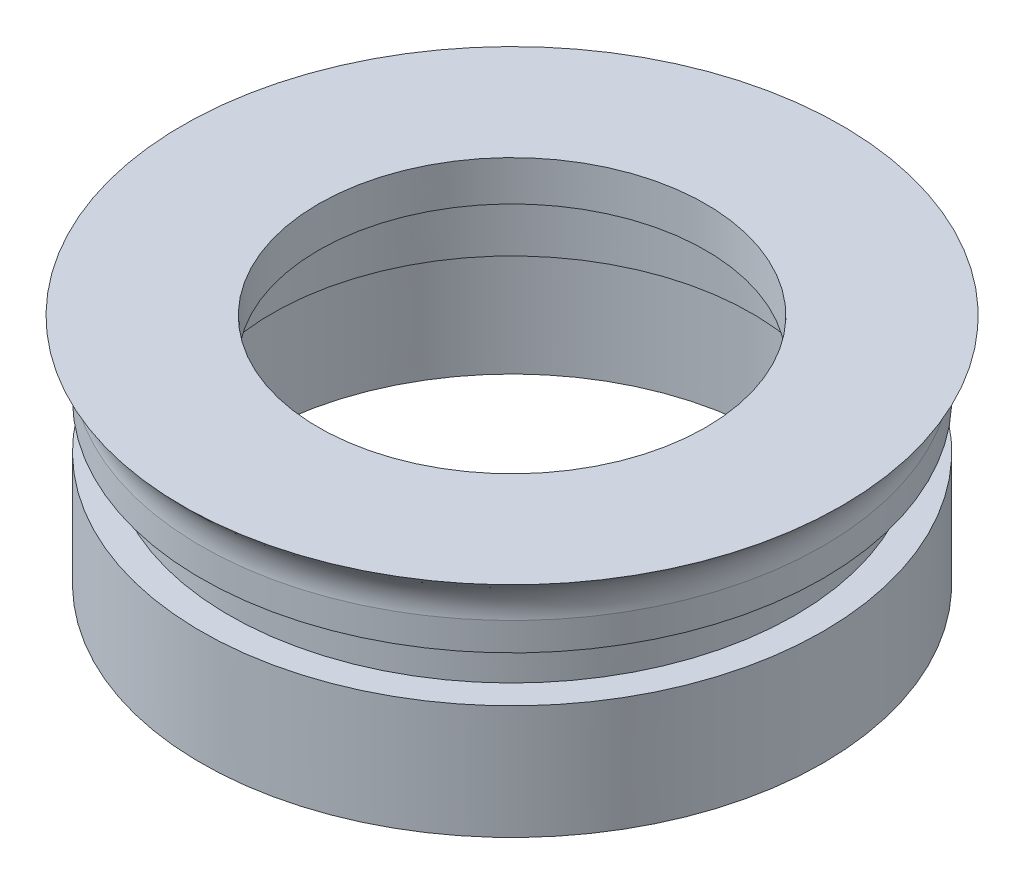
ISO-10303-21;
HEADER;
FILE_DESCRIPTION(('STEP AP214'),'2;1');
FILE_NAME('part.step','',(''),(''),'','','');
FILE_SCHEMA(('AUTOMOTIVE_DESIGN { 1 0 10303 214 1 1 1 1 }'));
ENDSEC;
DATA;
#1=APPLICATION_CONTEXT('core data for automotive mechanical design processes');
#2=APPLICATION_PROTOCOL_DEFINITION('international standard','automotive_design',2000,#1);
#3=PRODUCT_CONTEXT('',#1,'mechanical');
#4=PRODUCT('Part','Part','',(#3));
#5=PRODUCT_RELATED_PRODUCT_CATEGORY('part','',(#4));
#6=PRODUCT_DEFINITION_FORMATION('','',#4);
#7=PRODUCT_DEFINITION_CONTEXT('part definition',#1,'design');
#8=PRODUCT_DEFINITION('design','',#6,#7);
#9=PRODUCT_DEFINITION_SHAPE('','',#8);
#10=(LENGTH_UNIT() NAMED_UNIT(*) SI_UNIT(.MILLI.,.METRE.));
#11=(NAMED_UNIT(*) PLANE_ANGLE_UNIT() SI_UNIT($,.RADIAN.));
#12=(NAMED_UNIT(*) SI_UNIT($,.STERADIAN.) SOLID_ANGLE_UNIT());
#13=UNCERTAINTY_MEASURE_WITH_UNIT(LENGTH_MEASURE(1.E-05),#10,'distance_accuracy_value','');
#14=(GEOMETRIC_REPRESENTATION_CONTEXT(3) GLOBAL_UNCERTAINTY_ASSIGNED_CONTEXT((#13)) GLOBAL_UNIT_ASSIGNED_CONTEXT((#10,
#11,#12)) REPRESENTATION_CONTEXT('',''));
#15=CARTESIAN_POINT('',(0.,0.,0.));
#16=DIRECTION('',(0.,0.,1.));
#17=DIRECTION('',(1.,0.,0.));
#18=AXIS2_PLACEMENT_3D('',#15,#16,#17);
#19=CARTESIAN_POINT('',(0.000572404513093927,11.7084095589581,0.));
#20=DIRECTION('',(-4.88883233480967E-05,-0.999999998804966,0.));
#21=DIRECTION('',(0.999999998804966,-4.88883233480967E-05,0.));
#22=AXIS2_PLACEMENT_3D('',#19,#20,#21);
#23=TOROIDAL_SURFACE('',#22,21.8890333037088,3.03530258227153);
#24=CARTESIAN_POINT('',(0.000688708905054544,14.0873905477948,0.));
#25=DIRECTION('',(-4.88883233480967E-05,-0.999999998804966,0.));
#26=DIRECTION('',(0.999999998804966,-4.88883233480967E-05,0.));
#27=AXIS2_PLACEMENT_3D('',#24,#25,#26);
#28=CIRCLE('',#27,20.0039573882161);
#29=CARTESIAN_POINT('',(20.0046460732157,14.0864125878578,0.));
#30=VERTEX_POINT('',#29);
#31=EDGE_CURVE('E10',#30,#30,#28,.T.);
#32=ORIENTED_EDGE('',*,*,#31,.T.);
#33=EDGE_LOOP('',(#32));
#34=FACE_BOUND('',#33,.T.);
#35=CARTESIAN_POINT('',(0.000557715091473496,11.4079406412845,0.));
#36=DIRECTION('',(-4.88883233480967E-05,-0.999999998804966,0.));
#37=DIRECTION('',(0.999999998804966,-4.88883233480967E-05,0.));
#38=AXIS2_PLACEMENT_3D('',#35,#36,#37);
#39=CIRCLE('',#38,18.8686392573565);
#40=CARTESIAN_POINT('',(18.8691969498993,11.4070181851473,0.));
#41=VERTEX_POINT('',#40);
#42=EDGE_CURVE('E73',#41,#41,#39,.T.);
#43=ORIENTED_EDGE('',*,*,#42,.F.);
#44=EDGE_LOOP('',(#43));
#45=FACE_BOUND('',#44,.T.);
#46=ADVANCED_FACE('F30',(#34,#45),#23,.F.);
#47=CARTESIAN_POINT('',(0.000688708905054544,14.0873905477948,0.));
#48=DIRECTION('',(4.88883233480967E-05,0.999999998804966,0.));
#49=DIRECTION('',(-0.999999998804966,4.88883233480967E-05,0.));
#50=AXIS2_PLACEMENT_3D('',#47,#48,#49);
#51=CONICAL_SURFACE('',#50,20.0039573882161,1.57074743847153);
#52=CARTESIAN_POINT('',(0.000688689181484914,14.0869871064768,0.));
#53=DIRECTION('',(-4.88883233480967E-05,-0.999999998804966,0.));
#54=DIRECTION('',(0.999999998804966,-4.88883233480967E-05,0.));
#55=AXIS2_PLACEMENT_3D('',#52,#53,#54);
#56=CIRCLE('',#55,11.7516531493311);
#57=CARTESIAN_POINT('',(11.752341824469,14.0864125878578,0.));
#58=VERTEX_POINT('',#57);
#59=EDGE_CURVE('E36',#58,#58,#56,.T.);
#60=ORIENTED_EDGE('',*,*,#59,.T.);
#61=EDGE_LOOP('',(#60));
#62=FACE_BOUND('',#61,.T.);
#63=ORIENTED_EDGE('',*,*,#31,.F.);
#64=EDGE_LOOP('',(#63));
#65=FACE_BOUND('',#64,.T.);
#66=ADVANCED_FACE('F81',(#62,#65),#51,.F.);
#67=CARTESIAN_POINT('',(0.000688689181484914,14.0869871064768,0.));
#68=DIRECTION('',(-4.88883233480967E-05,-0.999999998804966,0.));
#69=DIRECTION('',(0.999999998804966,-4.88883233480967E-05,0.));
#70=AXIS2_PLACEMENT_3D('',#67,#68,#69);
#71=CONICAL_SURFACE('',#70,11.7516531493311,4.88883233672226E-05);
#72=CARTESIAN_POINT('',(0.000569602496550781,11.6510949212633,0.));
#73=DIRECTION('',(-4.88883233480967E-05,-0.999999998804966,0.));
#74=DIRECTION('',(0.999999998804966,-4.88883233480967E-05,0.));
#75=AXIS2_PLACEMENT_3D('',#72,#73,#74);
#76=CIRCLE('',#75,11.7517722360162);
#77=CARTESIAN_POINT('',(11.752341824469,11.6505203968223,0.));
#78=VERTEX_POINT('',#77);
#79=EDGE_CURVE('E40',#78,#78,#76,.T.);
#80=ORIENTED_EDGE('',*,*,#79,.T.);
#81=EDGE_LOOP('',(#80));
#82=FACE_BOUND('',#81,.T.);
#83=ORIENTED_EDGE('',*,*,#59,.F.);
#84=EDGE_LOOP('',(#83));
#85=FACE_BOUND('',#84,.T.);
#86=ADVANCED_FACE('F85',(#82,#85),#71,.F.);
#87=CARTESIAN_POINT('',(0.000569602496550781,11.6510949212633,0.));
#88=DIRECTION('',(4.88883233480967E-05,0.999999998804966,0.));
#89=DIRECTION('',(-0.999999998804966,4.88883233480967E-05,0.));
#90=AXIS2_PLACEMENT_3D('',#87,#88,#89);
#91=CONICAL_SURFACE('',#90,11.7517722360162,1.57074743847153);
#92=CARTESIAN_POINT('',(0.000569609199084234,11.6512320201242,0.));
#93=DIRECTION('',(-4.88883233480967E-05,-0.999999998804966,0.));
#94=DIRECTION('',(0.999999998804966,-4.88883233480967E-05,0.));
#95=AXIS2_PLACEMENT_3D('',#92,#93,#94);
#96=CIRCLE('',#95,14.5560995594777);
#97=CARTESIAN_POINT('',(14.5566691512817,11.6505203968223,0.));
#98=VERTEX_POINT('',#97);
#99=EDGE_CURVE('E44',#98,#98,#96,.T.);
#100=ORIENTED_EDGE('',*,*,#99,.T.);
#101=EDGE_LOOP('',(#100));
#102=FACE_BOUND('',#101,.T.);
#103=ORIENTED_EDGE('',*,*,#79,.F.);
#104=EDGE_LOOP('',(#103));
#105=FACE_BOUND('',#104,.T.);
#106=ADVANCED_FACE('F89',(#102,#105),#91,.T.);
#107=CARTESIAN_POINT('',(0.000569609199084234,11.6512320201242,0.));
#108=DIRECTION('',(-4.88883233480967E-05,-0.999999998804966,0.));
#109=DIRECTION('',(0.999999998804966,-4.88883233480967E-05,0.));
#110=AXIS2_PLACEMENT_3D('',#107,#108,#109);
#111=CONICAL_SURFACE('',#110,14.5560995594777,4.8888323367551E-05);
#112=CARTESIAN_POINT('',(0.000338980536321086,6.93377298915264,0.));
#113=DIRECTION('',(-4.88883233480967E-05,-0.999999998804966,0.));
#114=DIRECTION('',(0.999999998804966,-4.88883233480967E-05,0.));
#115=AXIS2_PLACEMENT_3D('',#112,#113,#114);
#116=CIRCLE('',#115,14.5563301881407);
#117=CARTESIAN_POINT('',(14.5566691512817,6.93306135457564,0.));
#118=VERTEX_POINT('',#117);
#119=EDGE_CURVE('E49',#118,#118,#116,.T.);
#120=ORIENTED_EDGE('',*,*,#119,.T.);
#121=EDGE_LOOP('',(#120));
#122=FACE_BOUND('',#121,.T.);
#123=ORIENTED_EDGE('',*,*,#99,.F.);
#124=EDGE_LOOP('',(#123));
#125=FACE_BOUND('',#124,.T.);
#126=ADVANCED_FACE('F96',(#122,#125),#111,.F.);
#127=CARTESIAN_POINT('',(0.000338980536321086,6.93377298915264,0.));
#128=DIRECTION('',(4.88883233480967E-05,0.999999998804966,0.));
#129=DIRECTION('',(-0.999999998804966,4.88883233480967E-05,0.));
#130=AXIS2_PLACEMENT_3D('',#127,#128,#129);
#131=CONICAL_SURFACE('',#130,14.5563301881407,1.57074743847153);
#132=CARTESIAN_POINT('',(0.000338982962872796,6.93382262373899,0.));
#133=DIRECTION('',(-4.88883233480967E-05,-0.999999998804966,0.));
#134=DIRECTION('',(0.999999998804966,-4.88883233480967E-05,0.));
#135=AXIS2_PLACEMENT_3D('',#132,#133,#134);
#136=CIRCLE('',#135,15.5715948353508);
#137=CARTESIAN_POINT('',(15.5719337997051,6.93306135457564,0.));
#138=VERTEX_POINT('',#137);
#139=EDGE_CURVE('E52',#138,#138,#136,.T.);
#140=ORIENTED_EDGE('',*,*,#139,.T.);
#141=EDGE_LOOP('',(#140));
#142=FACE_BOUND('',#141,.T.);
#143=ORIENTED_EDGE('',*,*,#119,.F.);
#144=EDGE_LOOP('',(#143));
#145=FACE_BOUND('',#144,.T.);
#146=ADVANCED_FACE('F100',(#142,#145),#131,.T.);
#147=CARTESIAN_POINT('',(0.000338982962872796,6.93382262373899,0.));
#148=DIRECTION('',(-4.88883233480967E-05,-0.999999998804966,0.));
#149=DIRECTION('',(0.999999998804966,-4.88883233480967E-05,0.));
#150=AXIS2_PLACEMENT_3D('',#147,#148,#149);
#151=CONICAL_SURFACE('',#150,15.5715948353508,0.00190114994897483);
#152=CARTESIAN_POINT('',(0.,2.70676856213777E-11,0.));
#153=DIRECTION('',(-4.88883233480967E-05,-0.999999998804966,0.));
#154=DIRECTION('',(0.999999998804966,-4.88883233480967E-05,0.));
#155=AXIS2_PLACEMENT_3D('',#152,#153,#154);
#156=CIRCLE('',#155,15.5847770877757);
#157=CARTESIAN_POINT('',(15.5847770691514,-0.000761913594507502,0.));
#158=VERTEX_POINT('',#157);
#159=EDGE_CURVE('E55',#158,#158,#156,.T.);
#160=ORIENTED_EDGE('',*,*,#159,.T.);
#161=EDGE_LOOP('',(#160));
#162=FACE_BOUND('',#161,.T.);
#163=ORIENTED_EDGE('',*,*,#139,.F.);
#164=EDGE_LOOP('',(#163));
#165=FACE_BOUND('',#164,.T.);
#166=ADVANCED_FACE('F104',(#162,#165),#151,.F.);
#167=CARTESIAN_POINT('',(0.,2.70676856213777E-11,0.));
#168=DIRECTION('',(4.88883233480967E-05,0.999999998804966,0.));
#169=DIRECTION('',(-0.999999998804966,4.88883233480967E-05,0.));
#170=AXIS2_PLACEMENT_3D('',#167,#168,#169);
#171=CONICAL_SURFACE('',#170,15.5847770877757,1.57074743847153);
#172=CARTESIAN_POINT('',(7.84998870353714E-09,0.00016056980801453,0.));
#173=DIRECTION('',(-4.88883233480967E-05,-0.999999998804966,0.));
#174=DIRECTION('',(0.999999998804966,-4.88883233480967E-05,0.));
#175=AXIS2_PLACEMENT_3D('',#172,#173,#174);
#176=CIRCLE('',#175,18.8691969645538);
#177=CARTESIAN_POINT('',(18.8691969498545,-0.000761913594507502,0.));
#178=VERTEX_POINT('',#177);
#179=EDGE_CURVE('E58',#178,#178,#176,.T.);
#180=ORIENTED_EDGE('',*,*,#179,.T.);
#181=EDGE_LOOP('',(#180));
#182=FACE_BOUND('',#181,.T.);
#183=ORIENTED_EDGE('',*,*,#159,.F.);
#184=EDGE_LOOP('',(#183));
#185=FACE_BOUND('',#184,.T.);
#186=ADVANCED_FACE('F108',(#182,#185),#171,.T.);
#187=CARTESIAN_POINT('',(7.84998870353714E-09,0.00016056980801453,0.));
#188=DIRECTION('',(-4.88883233480967E-05,-0.999999998804966,0.));
#189=DIRECTION('',(0.999999998804966,-4.88883233480967E-05,0.));
#190=AXIS2_PLACEMENT_3D('',#187,#188,#189);
#191=CONICAL_SURFACE('',#190,18.8691969645538,4.88883233677381E-05);
#192=CARTESIAN_POINT('',(0.000338399637399658,6.92189082832257,0.));
#193=DIRECTION('',(-4.88883233480967E-05,-0.999999998804966,0.));
#194=DIRECTION('',(0.999999998804966,-4.88883233480967E-05,0.));
#195=AXIS2_PLACEMENT_3D('',#192,#193,#194);
#196=CIRCLE('',#195,18.868858572766);
#197=CARTESIAN_POINT('',(18.8691969498545,6.92096836146346,0.));
#198=VERTEX_POINT('',#197);
#199=EDGE_CURVE('E61',#198,#198,#196,.T.);
#200=ORIENTED_EDGE('',*,*,#199,.T.);
#201=EDGE_LOOP('',(#200));
#202=FACE_BOUND('',#201,.T.);
#203=ORIENTED_EDGE('',*,*,#179,.F.);
#204=EDGE_LOOP('',(#203));
#205=FACE_BOUND('',#204,.T.);
#206=ADVANCED_FACE('F112',(#202,#205),#191,.T.);
#207=CARTESIAN_POINT('',(0.000338399637399658,6.92189082832257,0.));
#208=DIRECTION('',(4.88883233480967E-05,0.999999998804966,0.));
#209=DIRECTION('',(-0.999999998804966,4.88883233480967E-05,0.));
#210=AXIS2_PLACEMENT_3D('',#207,#208,#209);
#211=CONICAL_SURFACE('',#210,18.868858572766,1.57074743847153);
#212=CARTESIAN_POINT('',(0.000338395582956758,6.92180789557674,0.));
#213=DIRECTION('',(-4.88883233480967E-05,-0.999999998804966,0.));
#214=DIRECTION('',(0.999999998804966,-4.88883233480967E-05,0.));
#215=AXIS2_PLACEMENT_3D('',#212,#213,#214);
#216=CIRCLE('',#215,17.1724873300374);
#217=CARTESIAN_POINT('',(17.1728257050987,6.92096836146346,0.));
#218=VERTEX_POINT('',#217);
#219=EDGE_CURVE('E64',#218,#218,#216,.T.);
#220=ORIENTED_EDGE('',*,*,#219,.T.);
#221=EDGE_LOOP('',(#220));
#222=FACE_BOUND('',#221,.T.);
#223=ORIENTED_EDGE('',*,*,#199,.F.);
#224=EDGE_LOOP('',(#223));
#225=FACE_BOUND('',#224,.T.);
#226=ADVANCED_FACE('F116',(#222,#225),#211,.F.);
#227=CARTESIAN_POINT('',(0.000338395582956758,6.92180789557674,0.));
#228=DIRECTION('',(-4.88883233480967E-05,-0.999999998804966,0.));
#229=DIRECTION('',(0.999999998804966,-4.88883233480967E-05,0.));
#230=AXIS2_PLACEMENT_3D('',#227,#228,#229);
#231=CONICAL_SURFACE('',#230,17.1724873300374,4.88883233677617E-05);
#232=CARTESIAN_POINT('',(0.000474393516555439,9.70361598639263,0.));
#233=DIRECTION('',(-4.88883233480967E-05,-0.999999998804966,0.));
#234=DIRECTION('',(0.999999998804966,-4.88883233480967E-05,0.));
#235=AXIS2_PLACEMENT_3D('',#232,#233,#234);
#236=CIRCLE('',#235,17.1723513321037);
#237=CARTESIAN_POINT('',(17.1728257050987,9.70277645892806,0.));
#238=VERTEX_POINT('',#237);
#239=EDGE_CURVE('E67',#238,#238,#236,.T.);
#240=ORIENTED_EDGE('',*,*,#239,.T.);
#241=EDGE_LOOP('',(#240));
#242=FACE_BOUND('',#241,.T.);
#243=ORIENTED_EDGE('',*,*,#219,.F.);
#244=EDGE_LOOP('',(#243));
#245=FACE_BOUND('',#244,.T.);
#246=ADVANCED_FACE('F120',(#242,#245),#231,.T.);
#247=CARTESIAN_POINT('',(0.000474393516555439,9.70361598639263,0.));
#248=DIRECTION('',(4.88883233480967E-05,0.999999998804966,0.));
#249=DIRECTION('',(-0.999999998804966,4.88883233480967E-05,0.));
#250=AXIS2_PLACEMENT_3D('',#247,#248,#249);
#251=CONICAL_SURFACE('',#250,17.1723513321037,1.57074743847153);
#252=CARTESIAN_POINT('',(0.000474397570998339,9.70369891913847,0.));
#253=DIRECTION('',(-4.88883233480967E-05,-0.999999998804966,0.));
#254=DIRECTION('',(0.999999998804966,-4.88883233480967E-05,0.));
#255=AXIS2_PLACEMENT_3D('',#252,#253,#254);
#256=CIRCLE('',#255,18.8687225748771);
#257=CARTESIAN_POINT('',(18.8691969498993,9.70277645892806,0.));
#258=VERTEX_POINT('',#257);
#259=EDGE_CURVE('E70',#258,#258,#256,.T.);
#260=ORIENTED_EDGE('',*,*,#259,.T.);
#261=EDGE_LOOP('',(#260));
#262=FACE_BOUND('',#261,.T.);
#263=ORIENTED_EDGE('',*,*,#239,.F.);
#264=EDGE_LOOP('',(#263));
#265=FACE_BOUND('',#264,.T.);
#266=ADVANCED_FACE('F124',(#262,#265),#251,.T.);
#267=CARTESIAN_POINT('',(0.000474397570998339,9.70369891913847,0.));
#268=DIRECTION('',(-4.88883233480967E-05,-0.999999998804966,0.));
#269=DIRECTION('',(0.999999998804966,-4.88883233480967E-05,0.));
#270=AXIS2_PLACEMENT_3D('',#267,#268,#269);
#271=CONICAL_SURFACE('',#270,18.8687225748771,4.88883233669993E-05);
#272=ORIENTED_EDGE('',*,*,#42,.T.);
#273=EDGE_LOOP('',(#272));
#274=FACE_BOUND('',#273,.T.);
#275=ORIENTED_EDGE('',*,*,#259,.F.);
#276=EDGE_LOOP('',(#275));
#277=FACE_BOUND('',#276,.T.);
#278=ADVANCED_FACE('F77',(#274,#277),#271,.T.);
#279=CLOSED_SHELL('',(#46,#66,#86,#106,#126,#146,#166,#186,#206,#226,#246,#266,#278));
#280=MANIFOLD_SOLID_BREP('B2',#279);
#281=ADVANCED_BREP_SHAPE_REPRESENTATION('',(#18,#280),#14);
#282=SHAPE_DEFINITION_REPRESENTATION(#9,#281);
ENDSEC;
END-ISO-10303-21;
